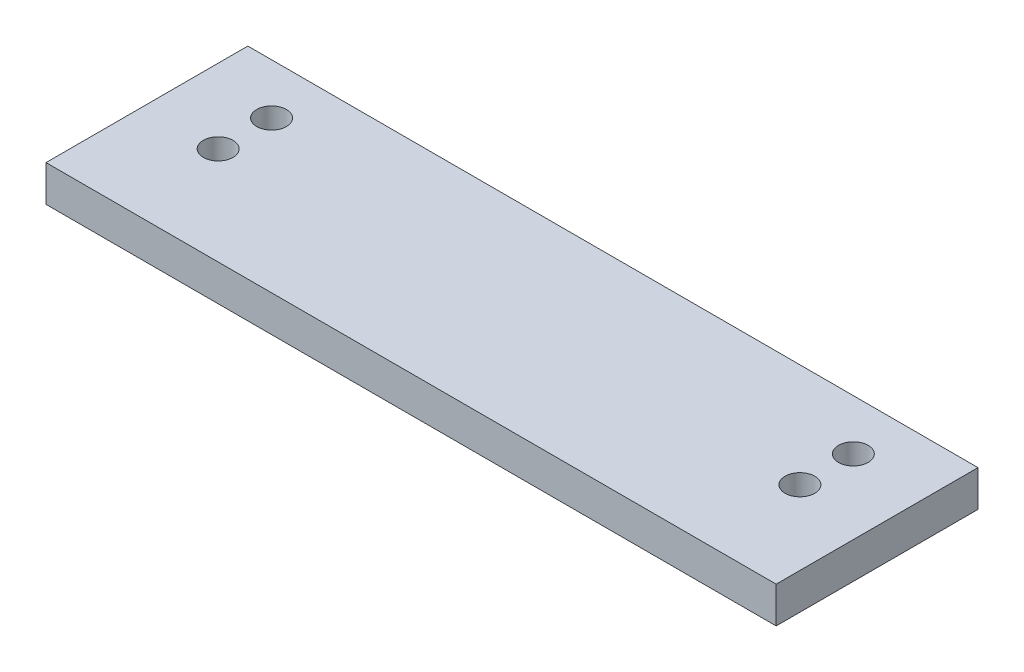
ISO-10303-21;
HEADER;
FILE_DESCRIPTION(('STEP AP214'),'2;1');
FILE_NAME('part.step','',(''),(''),'','','');
FILE_SCHEMA(('AUTOMOTIVE_DESIGN { 1 0 10303 214 1 1 1 1 }'));
ENDSEC;
DATA;
#1=APPLICATION_CONTEXT('core data for automotive mechanical design processes');
#2=APPLICATION_PROTOCOL_DEFINITION('international standard','automotive_design',2000,#1);
#3=PRODUCT_CONTEXT('',#1,'mechanical');
#4=PRODUCT('Part','Part','',(#3));
#5=PRODUCT_RELATED_PRODUCT_CATEGORY('part','',(#4));
#6=PRODUCT_DEFINITION_FORMATION('','',#4);
#7=PRODUCT_DEFINITION_CONTEXT('part definition',#1,'design');
#8=PRODUCT_DEFINITION('design','',#6,#7);
#9=PRODUCT_DEFINITION_SHAPE('','',#8);
#10=(LENGTH_UNIT() NAMED_UNIT(*) SI_UNIT(.MILLI.,.METRE.));
#11=(NAMED_UNIT(*) PLANE_ANGLE_UNIT() SI_UNIT($,.RADIAN.));
#12=(NAMED_UNIT(*) SI_UNIT($,.STERADIAN.) SOLID_ANGLE_UNIT());
#13=UNCERTAINTY_MEASURE_WITH_UNIT(LENGTH_MEASURE(1.E-05),#10,'distance_accuracy_value','');
#14=(GEOMETRIC_REPRESENTATION_CONTEXT(3) GLOBAL_UNCERTAINTY_ASSIGNED_CONTEXT((#13)) GLOBAL_UNIT_ASSIGNED_CONTEXT((#10,
#11,#12)) REPRESENTATION_CONTEXT('',''));
#15=CARTESIAN_POINT('',(0.,0.,0.));
#16=DIRECTION('',(0.,0.,1.));
#17=DIRECTION('',(1.,0.,0.));
#18=AXIS2_PLACEMENT_3D('',#15,#16,#17);
#19=CARTESIAN_POINT('',(0.,3.05,0.));
#20=DIRECTION('',(1.,0.,0.));
#21=DIRECTION('',(0.,0.,-1.));
#22=AXIS2_PLACEMENT_3D('',#19,#20,#21);
#23=PLANE('',#22);
#24=DIRECTION('',(0.,0.,1.));
#25=VECTOR('',#24,1.);
#26=CARTESIAN_POINT('',(0.,0.,0.));
#27=LINE('',#26,#25);
#28=CARTESIAN_POINT('',(0.,0.,-17.));
#29=VERTEX_POINT('',#28);
#30=CARTESIAN_POINT('',(0.,0.,0.));
#31=VERTEX_POINT('',#30);
#32=EDGE_CURVE('E111',#29,#31,#27,.T.);
#33=ORIENTED_EDGE('',*,*,#32,.T.);
#34=DIRECTION('',(0.,-1.,0.));
#35=VECTOR('',#34,1.);
#36=CARTESIAN_POINT('',(0.,3.05,0.));
#37=LINE('',#36,#35);
#38=CARTESIAN_POINT('',(0.,3.05,0.));
#39=VERTEX_POINT('',#38);
#40=EDGE_CURVE('E11',#39,#31,#37,.T.);
#41=ORIENTED_EDGE('',*,*,#40,.F.);
#42=DIRECTION('',(0.,0.,1.));
#43=VECTOR('',#42,1.);
#44=CARTESIAN_POINT('',(0.,3.05,0.));
#45=LINE('',#44,#43);
#46=CARTESIAN_POINT('',(0.,3.05,-17.));
#47=VERTEX_POINT('',#46);
#48=EDGE_CURVE('E95',#47,#39,#45,.T.);
#49=ORIENTED_EDGE('',*,*,#48,.F.);
#50=DIRECTION('',(0.,-1.,0.));
#51=VECTOR('',#50,1.);
#52=CARTESIAN_POINT('',(0.,3.05,-17.));
#53=LINE('',#52,#51);
#54=EDGE_CURVE('E107',#47,#29,#53,.T.);
#55=ORIENTED_EDGE('',*,*,#54,.T.);
#56=EDGE_LOOP('',(#33,#41,#49,#55));
#57=FACE_BOUND('',#56,.T.);
#58=ADVANCED_FACE('F43',(#57),#23,.F.);
#59=CARTESIAN_POINT('',(0.,3.05,0.));
#60=DIRECTION('',(0.,0.,-1.));
#61=DIRECTION('',(-1.,0.,0.));
#62=AXIS2_PLACEMENT_3D('',#59,#60,#61);
#63=PLANE('',#62);
#64=DIRECTION('',(1.,0.,0.));
#65=VECTOR('',#64,1.);
#66=CARTESIAN_POINT('',(0.,0.,0.));
#67=LINE('',#66,#65);
#68=CARTESIAN_POINT('',(61.5,0.,0.));
#69=VERTEX_POINT('',#68);
#70=EDGE_CURVE('E100',#31,#69,#67,.T.);
#71=ORIENTED_EDGE('',*,*,#70,.T.);
#72=DIRECTION('',(0.,-1.,0.));
#73=VECTOR('',#72,1.);
#74=CARTESIAN_POINT('',(61.5,3.05,0.));
#75=LINE('',#74,#73);
#76=CARTESIAN_POINT('',(61.5,3.05,0.));
#77=VERTEX_POINT('',#76);
#78=EDGE_CURVE('E52',#77,#69,#75,.T.);
#79=ORIENTED_EDGE('',*,*,#78,.F.);
#80=DIRECTION('',(1.,0.,0.));
#81=VECTOR('',#80,1.);
#82=CARTESIAN_POINT('',(0.,3.05,0.));
#83=LINE('',#82,#81);
#84=EDGE_CURVE('E90',#39,#77,#83,.T.);
#85=ORIENTED_EDGE('',*,*,#84,.F.);
#86=ORIENTED_EDGE('',*,*,#40,.T.);
#87=EDGE_LOOP('',(#71,#79,#85,#86));
#88=FACE_BOUND('',#87,.T.);
#89=ADVANCED_FACE('F99',(#88),#63,.F.);
#90=CARTESIAN_POINT('',(61.5,3.05,0.));
#91=DIRECTION('',(-1.,0.,0.));
#92=DIRECTION('',(0.,0.,1.));
#93=AXIS2_PLACEMENT_3D('',#90,#91,#92);
#94=PLANE('',#93);
#95=DIRECTION('',(0.,0.,-1.));
#96=VECTOR('',#95,1.);
#97=CARTESIAN_POINT('',(61.5,0.,0.));
#98=LINE('',#97,#96);
#99=CARTESIAN_POINT('',(61.5,0.,-17.));
#100=VERTEX_POINT('',#99);
#101=EDGE_CURVE('E77',#69,#100,#98,.T.);
#102=ORIENTED_EDGE('',*,*,#101,.T.);
#103=DIRECTION('',(0.,-1.,0.));
#104=VECTOR('',#103,1.);
#105=CARTESIAN_POINT('',(61.5,3.05,-17.));
#106=LINE('',#105,#104);
#107=CARTESIAN_POINT('',(61.5,3.05,-17.));
#108=VERTEX_POINT('',#107);
#109=EDGE_CURVE('E102',#108,#100,#106,.T.);
#110=ORIENTED_EDGE('',*,*,#109,.F.);
#111=DIRECTION('',(0.,0.,-1.));
#112=VECTOR('',#111,1.);
#113=CARTESIAN_POINT('',(61.5,3.05,0.));
#114=LINE('',#113,#112);
#115=EDGE_CURVE('E93',#77,#108,#114,.T.);
#116=ORIENTED_EDGE('',*,*,#115,.F.);
#117=ORIENTED_EDGE('',*,*,#78,.T.);
#118=EDGE_LOOP('',(#102,#110,#116,#117));
#119=FACE_BOUND('',#118,.T.);
#120=ADVANCED_FACE('F103',(#119),#94,.F.);
#121=CARTESIAN_POINT('',(0.,3.05,-17.));
#122=DIRECTION('',(0.,0.,1.));
#123=DIRECTION('',(1.,0.,0.));
#124=AXIS2_PLACEMENT_3D('',#121,#122,#123);
#125=PLANE('',#124);
#126=DIRECTION('',(-1.,0.,0.));
#127=VECTOR('',#126,1.);
#128=CARTESIAN_POINT('',(0.,0.,-17.));
#129=LINE('',#128,#127);
#130=EDGE_CURVE('E83',#100,#29,#129,.T.);
#131=ORIENTED_EDGE('',*,*,#130,.T.);
#132=ORIENTED_EDGE('',*,*,#54,.F.);
#133=DIRECTION('',(-1.,0.,0.));
#134=VECTOR('',#133,1.);
#135=CARTESIAN_POINT('',(0.,3.05,-17.));
#136=LINE('',#135,#134);
#137=EDGE_CURVE('E60',#108,#47,#136,.T.);
#138=ORIENTED_EDGE('',*,*,#137,.F.);
#139=ORIENTED_EDGE('',*,*,#109,.T.);
#140=EDGE_LOOP('',(#131,#132,#138,#139));
#141=FACE_BOUND('',#140,.T.);
#142=ADVANCED_FACE('F125',(#141),#125,.F.);
#143=CARTESIAN_POINT('',(0.,3.05,0.));
#144=DIRECTION('',(0.,-1.,0.));
#145=DIRECTION('',(0.,0.,-1.));
#146=AXIS2_PLACEMENT_3D('',#143,#144,#145);
#147=PLANE('',#146);
#148=CARTESIAN_POINT('',(6.25,3.05,-8.25));
#149=DIRECTION('',(0.,1.,0.));
#150=DIRECTION('',(0.,0.,1.));
#151=AXIS2_PLACEMENT_3D('',#148,#149,#150);
#152=CIRCLE('',#151,1.25);
#153=CARTESIAN_POINT('',(6.25,3.05,-7.));
#154=VERTEX_POINT('',#153);
#155=EDGE_CURVE('E149',#154,#154,#152,.T.);
#156=ORIENTED_EDGE('',*,*,#155,.F.);
#157=EDGE_LOOP('',(#156));
#158=FACE_BOUND('',#157,.T.);
#159=CARTESIAN_POINT('',(55.25,3.05,-12.75));
#160=DIRECTION('',(0.,1.,0.));
#161=DIRECTION('',(0.,0.,1.));
#162=AXIS2_PLACEMENT_3D('',#159,#160,#161);
#163=CIRCLE('',#162,1.25);
#164=CARTESIAN_POINT('',(55.25,3.05,-11.5));
#165=VERTEX_POINT('',#164);
#166=EDGE_CURVE('E140',#165,#165,#163,.T.);
#167=ORIENTED_EDGE('',*,*,#166,.F.);
#168=EDGE_LOOP('',(#167));
#169=FACE_BOUND('',#168,.T.);
#170=CARTESIAN_POINT('',(55.25,3.05,-8.25));
#171=DIRECTION('',(0.,1.,0.));
#172=DIRECTION('',(0.,0.,1.));
#173=AXIS2_PLACEMENT_3D('',#170,#171,#172);
#174=CIRCLE('',#173,1.25);
#175=CARTESIAN_POINT('',(55.25,3.05,-7.));
#176=VERTEX_POINT('',#175);
#177=EDGE_CURVE('E156',#176,#176,#174,.T.);
#178=ORIENTED_EDGE('',*,*,#177,.F.);
#179=EDGE_LOOP('',(#178));
#180=FACE_BOUND('',#179,.T.);
#181=CARTESIAN_POINT('',(6.25,3.05,-12.75));
#182=DIRECTION('',(0.,1.,0.));
#183=DIRECTION('',(0.,0.,1.));
#184=AXIS2_PLACEMENT_3D('',#181,#182,#183);
#185=CIRCLE('',#184,1.25);
#186=CARTESIAN_POINT('',(6.25,3.05,-11.5));
#187=VERTEX_POINT('',#186);
#188=EDGE_CURVE('E132',#187,#187,#185,.T.);
#189=ORIENTED_EDGE('',*,*,#188,.F.);
#190=EDGE_LOOP('',(#189));
#191=FACE_BOUND('',#190,.T.);
#192=ORIENTED_EDGE('',*,*,#48,.T.);
#193=ORIENTED_EDGE('',*,*,#84,.T.);
#194=ORIENTED_EDGE('',*,*,#115,.T.);
#195=ORIENTED_EDGE('',*,*,#137,.T.);
#196=EDGE_LOOP('',(#192,#193,#194,#195));
#197=FACE_BOUND('',#196,.T.);
#198=ADVANCED_FACE('F91',(#158,#169,#180,#191,#197),#147,.F.);
#199=CARTESIAN_POINT('',(0.,0.,0.));
#200=DIRECTION('',(0.,-1.,0.));
#201=DIRECTION('',(0.,0.,-1.));
#202=AXIS2_PLACEMENT_3D('',#199,#200,#201);
#203=PLANE('',#202);
#204=CARTESIAN_POINT('',(6.25,0.,-8.25));
#205=DIRECTION('',(0.,1.,0.));
#206=DIRECTION('',(0.,0.,1.));
#207=AXIS2_PLACEMENT_3D('',#204,#205,#206);
#208=CIRCLE('',#207,1.25);
#209=CARTESIAN_POINT('',(6.25,0.,-7.));
#210=VERTEX_POINT('',#209);
#211=EDGE_CURVE('E136',#210,#210,#208,.T.);
#212=ORIENTED_EDGE('',*,*,#211,.T.);
#213=EDGE_LOOP('',(#212));
#214=FACE_BOUND('',#213,.T.);
#215=CARTESIAN_POINT('',(55.25,0.,-12.75));
#216=DIRECTION('',(0.,1.,0.));
#217=DIRECTION('',(0.,0.,1.));
#218=AXIS2_PLACEMENT_3D('',#215,#216,#217);
#219=CIRCLE('',#218,1.25);
#220=CARTESIAN_POINT('',(55.25,0.,-11.5));
#221=VERTEX_POINT('',#220);
#222=EDGE_CURVE('E144',#221,#221,#219,.T.);
#223=ORIENTED_EDGE('',*,*,#222,.T.);
#224=EDGE_LOOP('',(#223));
#225=FACE_BOUND('',#224,.T.);
#226=CARTESIAN_POINT('',(55.25,0.,-8.25));
#227=DIRECTION('',(0.,1.,0.));
#228=DIRECTION('',(0.,0.,1.));
#229=AXIS2_PLACEMENT_3D('',#226,#227,#228);
#230=CIRCLE('',#229,1.25);
#231=CARTESIAN_POINT('',(55.25,0.,-7.));
#232=VERTEX_POINT('',#231);
#233=EDGE_CURVE('E145',#232,#232,#230,.T.);
#234=ORIENTED_EDGE('',*,*,#233,.T.);
#235=EDGE_LOOP('',(#234));
#236=FACE_BOUND('',#235,.T.);
#237=CARTESIAN_POINT('',(6.25,0.,-12.75));
#238=DIRECTION('',(0.,1.,0.));
#239=DIRECTION('',(0.,0.,1.));
#240=AXIS2_PLACEMENT_3D('',#237,#238,#239);
#241=CIRCLE('',#240,1.25);
#242=CARTESIAN_POINT('',(6.25,0.,-11.5));
#243=VERTEX_POINT('',#242);
#244=EDGE_CURVE('E115',#243,#243,#241,.T.);
#245=ORIENTED_EDGE('',*,*,#244,.T.);
#246=EDGE_LOOP('',(#245));
#247=FACE_BOUND('',#246,.T.);
#248=ORIENTED_EDGE('',*,*,#32,.F.);
#249=ORIENTED_EDGE('',*,*,#130,.F.);
#250=ORIENTED_EDGE('',*,*,#101,.F.);
#251=ORIENTED_EDGE('',*,*,#70,.F.);
#252=EDGE_LOOP('',(#248,#249,#250,#251));
#253=FACE_BOUND('',#252,.T.);
#254=ADVANCED_FACE('F128',(#214,#225,#236,#247,#253),#203,.T.);
#255=CARTESIAN_POINT('',(6.25,0.,-12.75));
#256=DIRECTION('',(0.,1.,0.));
#257=DIRECTION('',(0.,0.,1.));
#258=AXIS2_PLACEMENT_3D('',#255,#256,#257);
#259=CYLINDRICAL_SURFACE('',#258,1.25);
#260=ORIENTED_EDGE('',*,*,#244,.F.);
#261=EDGE_LOOP('',(#260));
#262=FACE_BOUND('',#261,.T.);
#263=ORIENTED_EDGE('',*,*,#188,.T.);
#264=EDGE_LOOP('',(#263));
#265=FACE_BOUND('',#264,.T.);
#266=ADVANCED_FACE('F170',(#262,#265),#259,.F.);
#267=CARTESIAN_POINT('',(55.25,0.,-8.25));
#268=DIRECTION('',(0.,1.,0.));
#269=DIRECTION('',(0.,0.,1.));
#270=AXIS2_PLACEMENT_3D('',#267,#268,#269);
#271=CYLINDRICAL_SURFACE('',#270,1.25);
#272=ORIENTED_EDGE('',*,*,#233,.F.);
#273=EDGE_LOOP('',(#272));
#274=FACE_BOUND('',#273,.T.);
#275=ORIENTED_EDGE('',*,*,#177,.T.);
#276=EDGE_LOOP('',(#275));
#277=FACE_BOUND('',#276,.T.);
#278=ADVANCED_FACE('F166',(#274,#277),#271,.F.);
#279=CARTESIAN_POINT('',(55.25,0.,-12.75));
#280=DIRECTION('',(0.,1.,0.));
#281=DIRECTION('',(0.,0.,1.));
#282=AXIS2_PLACEMENT_3D('',#279,#280,#281);
#283=CYLINDRICAL_SURFACE('',#282,1.25);
#284=ORIENTED_EDGE('',*,*,#222,.F.);
#285=EDGE_LOOP('',(#284));
#286=FACE_BOUND('',#285,.T.);
#287=ORIENTED_EDGE('',*,*,#166,.T.);
#288=EDGE_LOOP('',(#287));
#289=FACE_BOUND('',#288,.T.);
#290=ADVANCED_FACE('F169',(#286,#289),#283,.F.);
#291=CARTESIAN_POINT('',(6.25,0.,-8.25));
#292=DIRECTION('',(0.,1.,0.));
#293=DIRECTION('',(0.,0.,1.));
#294=AXIS2_PLACEMENT_3D('',#291,#292,#293);
#295=CYLINDRICAL_SURFACE('',#294,1.25);
#296=ORIENTED_EDGE('',*,*,#211,.F.);
#297=EDGE_LOOP('',(#296));
#298=FACE_BOUND('',#297,.T.);
#299=ORIENTED_EDGE('',*,*,#155,.T.);
#300=EDGE_LOOP('',(#299));
#301=FACE_BOUND('',#300,.T.);
#302=ADVANCED_FACE('F234',(#298,#301),#295,.F.);
#303=CLOSED_SHELL('',(#58,#89,#120,#142,#198,#254,#266,#278,#290,#302));
#304=MANIFOLD_SOLID_BREP('B2',#303);
#305=ADVANCED_BREP_SHAPE_REPRESENTATION('',(#18,#304),#14);
#306=SHAPE_DEFINITION_REPRESENTATION(#9,#305);
ENDSEC;
END-ISO-10303-21;
